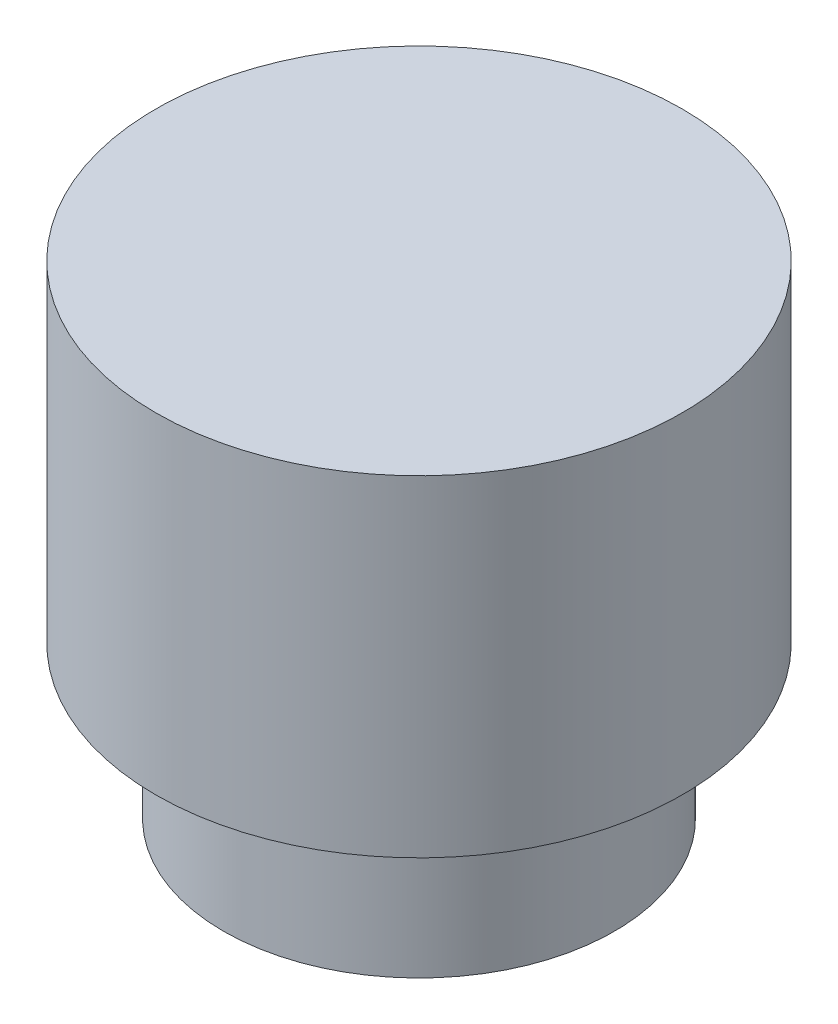
ISO-10303-21;
HEADER;
FILE_DESCRIPTION(('STEP AP214'),'2;1');
FILE_NAME('part.step','',(''),(''),'','','');
FILE_SCHEMA(('AUTOMOTIVE_DESIGN { 1 0 10303 214 1 1 1 1 }'));
ENDSEC;
DATA;
#1=APPLICATION_CONTEXT('core data for automotive mechanical design processes');
#2=APPLICATION_PROTOCOL_DEFINITION('international standard','automotive_design',2000,#1);
#3=PRODUCT_CONTEXT('',#1,'mechanical');
#4=PRODUCT('Part','Part','',(#3));
#5=PRODUCT_RELATED_PRODUCT_CATEGORY('part','',(#4));
#6=PRODUCT_DEFINITION_FORMATION('','',#4);
#7=PRODUCT_DEFINITION_CONTEXT('part definition',#1,'design');
#8=PRODUCT_DEFINITION('design','',#6,#7);
#9=PRODUCT_DEFINITION_SHAPE('','',#8);
#10=(LENGTH_UNIT() NAMED_UNIT(*) SI_UNIT(.MILLI.,.METRE.));
#11=(NAMED_UNIT(*) PLANE_ANGLE_UNIT() SI_UNIT($,.RADIAN.));
#12=(NAMED_UNIT(*) SI_UNIT($,.STERADIAN.) SOLID_ANGLE_UNIT());
#13=UNCERTAINTY_MEASURE_WITH_UNIT(LENGTH_MEASURE(1.E-05),#10,'distance_accuracy_value','');
#14=(GEOMETRIC_REPRESENTATION_CONTEXT(3) GLOBAL_UNCERTAINTY_ASSIGNED_CONTEXT((#13)) GLOBAL_UNIT_ASSIGNED_CONTEXT((#10,
#11,#12)) REPRESENTATION_CONTEXT('',''));
#15=CARTESIAN_POINT('',(0.,0.,0.));
#16=DIRECTION('',(0.,0.,1.));
#17=DIRECTION('',(1.,0.,0.));
#18=AXIS2_PLACEMENT_3D('',#15,#16,#17);
#19=CARTESIAN_POINT('',(0.,-2.2,0.));
#20=DIRECTION('',(0.,1.,0.));
#21=DIRECTION('',(0.,0.,1.));
#22=AXIS2_PLACEMENT_3D('',#19,#20,#21);
#23=CYLINDRICAL_SURFACE('',#22,1.75);
#24=CARTESIAN_POINT('',(0.,-2.2,0.));
#25=DIRECTION('',(0.,1.,0.));
#26=DIRECTION('',(0.,0.,1.));
#27=AXIS2_PLACEMENT_3D('',#24,#25,#26);
#28=CIRCLE('',#27,1.75);
#29=CARTESIAN_POINT('',(0.,-2.2,1.75));
#30=VERTEX_POINT('',#29);
#31=EDGE_CURVE('E49',#30,#30,#28,.T.);
#32=ORIENTED_EDGE('',*,*,#31,.T.);
#33=EDGE_LOOP('',(#32));
#34=FACE_BOUND('',#33,.T.);
#35=CARTESIAN_POINT('',(0.,0.,0.));
#36=DIRECTION('',(0.,1.,0.));
#37=DIRECTION('',(0.,0.,1.));
#38=AXIS2_PLACEMENT_3D('',#35,#36,#37);
#39=CIRCLE('',#38,1.75);
#40=CARTESIAN_POINT('',(0.,0.,1.75));
#41=VERTEX_POINT('',#40);
#42=EDGE_CURVE('E44',#41,#41,#39,.T.);
#43=ORIENTED_EDGE('',*,*,#42,.F.);
#44=EDGE_LOOP('',(#43));
#45=FACE_BOUND('',#44,.T.);
#46=ADVANCED_FACE('F41',(#34,#45),#23,.T.);
#47=CARTESIAN_POINT('',(0.,-2.2,0.));
#48=DIRECTION('',(0.,1.,0.));
#49=DIRECTION('',(0.,0.,1.));
#50=AXIS2_PLACEMENT_3D('',#47,#48,#49);
#51=PLANE('',#50);
#52=CARTESIAN_POINT('',(0.,-2.2,0.));
#53=DIRECTION('',(0.,-1.,0.));
#54=DIRECTION('',(0.,0.,-1.));
#55=AXIS2_PLACEMENT_3D('',#52,#53,#54);
#56=CIRCLE('',#55,1.3);
#57=CARTESIAN_POINT('',(0.,-2.2,-1.3));
#58=VERTEX_POINT('',#57);
#59=EDGE_CURVE('E10',#58,#58,#56,.T.);
#60=ORIENTED_EDGE('',*,*,#59,.F.);
#61=EDGE_LOOP('',(#60));
#62=FACE_BOUND('',#61,.T.);
#63=ORIENTED_EDGE('',*,*,#31,.F.);
#64=EDGE_LOOP('',(#63));
#65=FACE_BOUND('',#64,.T.);
#66=ADVANCED_FACE('F68',(#62,#65),#51,.F.);
#67=CARTESIAN_POINT('',(0.,0.,0.));
#68=DIRECTION('',(0.,1.,0.));
#69=DIRECTION('',(0.,0.,1.));
#70=AXIS2_PLACEMENT_3D('',#67,#68,#69);
#71=PLANE('',#70);
#72=ORIENTED_EDGE('',*,*,#42,.T.);
#73=EDGE_LOOP('',(#72));
#74=FACE_BOUND('',#73,.T.);
#75=ADVANCED_FACE('F65',(#74),#71,.T.);
#76=CARTESIAN_POINT('',(0.,-3.21,0.));
#77=DIRECTION('',(0.,1.,0.));
#78=DIRECTION('',(0.,0.,1.));
#79=AXIS2_PLACEMENT_3D('',#76,#77,#78);
#80=CYLINDRICAL_SURFACE('',#79,1.3);
#81=CARTESIAN_POINT('',(0.,-3.21,0.));
#82=DIRECTION('',(0.,-1.,0.));
#83=DIRECTION('',(0.,0.,-1.));
#84=AXIS2_PLACEMENT_3D('',#81,#82,#83);
#85=CIRCLE('',#84,1.3);
#86=CARTESIAN_POINT('',(0.,-3.21,-1.3));
#87=VERTEX_POINT('',#86);
#88=EDGE_CURVE('E56',#87,#87,#85,.T.);
#89=ORIENTED_EDGE('',*,*,#88,.F.);
#90=EDGE_LOOP('',(#89));
#91=FACE_BOUND('',#90,.T.);
#92=ORIENTED_EDGE('',*,*,#59,.T.);
#93=EDGE_LOOP('',(#92));
#94=FACE_BOUND('',#93,.T.);
#95=ADVANCED_FACE('F80',(#91,#94),#80,.T.);
#96=CARTESIAN_POINT('',(0.,-3.21,0.));
#97=DIRECTION('',(0.,-1.,0.));
#98=DIRECTION('',(0.,0.,-1.));
#99=AXIS2_PLACEMENT_3D('',#96,#97,#98);
#100=PLANE('',#99);
#101=ORIENTED_EDGE('',*,*,#88,.T.);
#102=EDGE_LOOP('',(#101));
#103=FACE_BOUND('',#102,.T.);
#104=ADVANCED_FACE('F84',(#103),#100,.T.);
#105=CLOSED_SHELL('',(#46,#66,#75,#95,#104));
#106=MANIFOLD_SOLID_BREP('B2',#105);
#107=ADVANCED_BREP_SHAPE_REPRESENTATION('',(#18,#106),#14);
#108=SHAPE_DEFINITION_REPRESENTATION(#9,#107);
ENDSEC;
END-ISO-10303-21;
